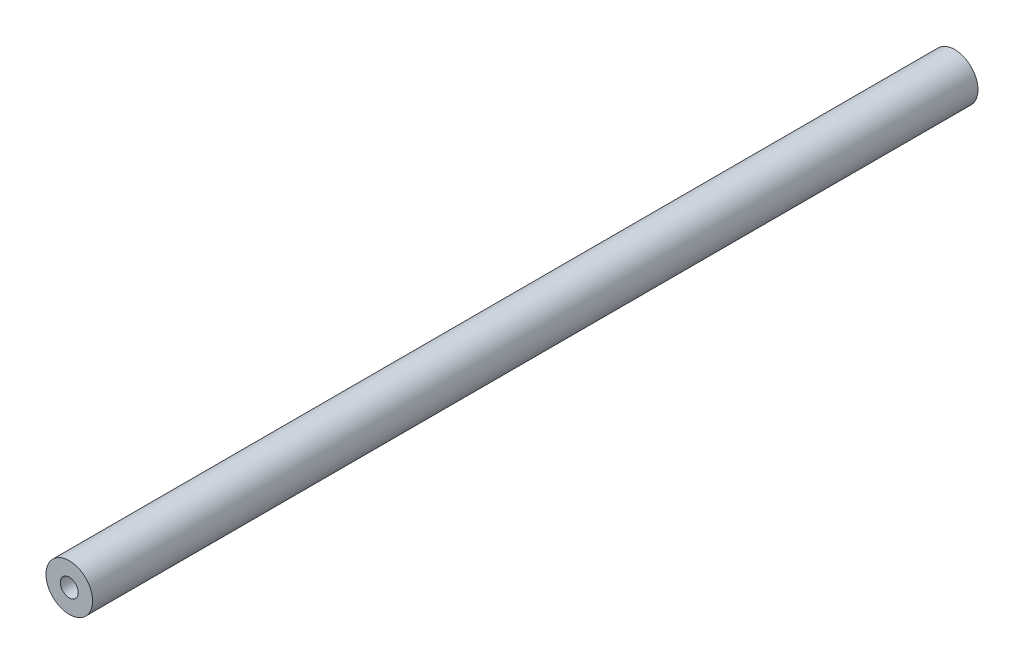
ISO-10303-21;
HEADER;
FILE_DESCRIPTION(('STEP AP214'),'2;1');
FILE_NAME('part.step','',(''),(''),'','','');
FILE_SCHEMA(('AUTOMOTIVE_DESIGN { 1 0 10303 214 1 1 1 1 }'));
ENDSEC;
DATA;
#1=APPLICATION_CONTEXT('core data for automotive mechanical design processes');
#2=APPLICATION_PROTOCOL_DEFINITION('international standard','automotive_design',2000,#1);
#3=PRODUCT_CONTEXT('',#1,'mechanical');
#4=PRODUCT('Part','Part','',(#3));
#5=PRODUCT_RELATED_PRODUCT_CATEGORY('part','',(#4));
#6=PRODUCT_DEFINITION_FORMATION('','',#4);
#7=PRODUCT_DEFINITION_CONTEXT('part definition',#1,'design');
#8=PRODUCT_DEFINITION('design','',#6,#7);
#9=PRODUCT_DEFINITION_SHAPE('','',#8);
#10=(LENGTH_UNIT() NAMED_UNIT(*) SI_UNIT(.MILLI.,.METRE.));
#11=(NAMED_UNIT(*) PLANE_ANGLE_UNIT() SI_UNIT($,.RADIAN.));
#12=(NAMED_UNIT(*) SI_UNIT($,.STERADIAN.) SOLID_ANGLE_UNIT());
#13=UNCERTAINTY_MEASURE_WITH_UNIT(LENGTH_MEASURE(1.E-05),#10,'distance_accuracy_value','');
#14=(GEOMETRIC_REPRESENTATION_CONTEXT(3) GLOBAL_UNCERTAINTY_ASSIGNED_CONTEXT((#13)) GLOBAL_UNIT_ASSIGNED_CONTEXT((#10,
#11,#12)) REPRESENTATION_CONTEXT('',''));
#15=CARTESIAN_POINT('',(0.,0.,0.));
#16=DIRECTION('',(0.,0.,1.));
#17=DIRECTION('',(1.,0.,0.));
#18=AXIS2_PLACEMENT_3D('',#15,#16,#17);
#19=CARTESIAN_POINT('',(0.,0.,123.5));
#20=DIRECTION('',(0.,0.,-1.));
#21=DIRECTION('',(-1.,0.,0.));
#22=AXIS2_PLACEMENT_3D('',#19,#20,#21);
#23=CYLINDRICAL_SURFACE('',#22,3.25);
#24=CARTESIAN_POINT('',(0.,0.,123.5));
#25=DIRECTION('',(0.,0.,1.));
#26=DIRECTION('',(1.,0.,0.));
#27=AXIS2_PLACEMENT_3D('',#24,#25,#26);
#28=CIRCLE('',#27,3.25);
#29=CARTESIAN_POINT('',(3.25,0.,123.5));
#30=VERTEX_POINT('',#29);
#31=EDGE_CURVE('E10',#30,#30,#28,.T.);
#32=ORIENTED_EDGE('',*,*,#31,.F.);
#33=EDGE_LOOP('',(#32));
#34=FACE_BOUND('',#33,.T.);
#35=CARTESIAN_POINT('',(0.,0.,0.));
#36=DIRECTION('',(0.,0.,1.));
#37=DIRECTION('',(1.,0.,0.));
#38=AXIS2_PLACEMENT_3D('',#35,#36,#37);
#39=CIRCLE('',#38,3.25);
#40=CARTESIAN_POINT('',(3.25,0.,0.));
#41=VERTEX_POINT('',#40);
#42=EDGE_CURVE('E38',#41,#41,#39,.T.);
#43=ORIENTED_EDGE('',*,*,#42,.T.);
#44=EDGE_LOOP('',(#43));
#45=FACE_BOUND('',#44,.T.);
#46=ADVANCED_FACE('F35',(#34,#45),#23,.T.);
#47=CARTESIAN_POINT('',(0.,0.,123.5));
#48=DIRECTION('',(0.,0.,1.));
#49=DIRECTION('',(1.,0.,0.));
#50=AXIS2_PLACEMENT_3D('',#47,#48,#49);
#51=PLANE('',#50);
#52=CARTESIAN_POINT('',(0.,0.,123.5));
#53=DIRECTION('',(0.,0.,1.));
#54=DIRECTION('',(1.,0.,0.));
#55=AXIS2_PLACEMENT_3D('',#52,#53,#54);
#56=CIRCLE('',#55,1.25);
#57=CARTESIAN_POINT('',(1.25,0.,123.5));
#58=VERTEX_POINT('',#57);
#59=EDGE_CURVE('E47',#58,#58,#56,.T.);
#60=ORIENTED_EDGE('',*,*,#59,.F.);
#61=EDGE_LOOP('',(#60));
#62=FACE_BOUND('',#61,.T.);
#63=ORIENTED_EDGE('',*,*,#31,.T.);
#64=EDGE_LOOP('',(#63));
#65=FACE_BOUND('',#64,.T.);
#66=ADVANCED_FACE('F72',(#62,#65),#51,.T.);
#67=CARTESIAN_POINT('',(0.,0.,0.));
#68=DIRECTION('',(0.,0.,1.));
#69=DIRECTION('',(1.,0.,0.));
#70=AXIS2_PLACEMENT_3D('',#67,#68,#69);
#71=PLANE('',#70);
#72=CARTESIAN_POINT('',(0.,0.,0.));
#73=DIRECTION('',(0.,0.,-1.));
#74=DIRECTION('',(-1.,0.,0.));
#75=AXIS2_PLACEMENT_3D('',#72,#73,#74);
#76=CIRCLE('',#75,1.25);
#77=CARTESIAN_POINT('',(-1.25,0.,0.));
#78=VERTEX_POINT('',#77);
#79=EDGE_CURVE('E53',#78,#78,#76,.T.);
#80=ORIENTED_EDGE('',*,*,#79,.F.);
#81=EDGE_LOOP('',(#80));
#82=FACE_BOUND('',#81,.T.);
#83=ORIENTED_EDGE('',*,*,#42,.F.);
#84=EDGE_LOOP('',(#83));
#85=FACE_BOUND('',#84,.T.);
#86=ADVANCED_FACE('F68',(#82,#85),#71,.F.);
#87=CARTESIAN_POINT('',(0.,0.,113.5));
#88=DIRECTION('',(0.,0.,1.));
#89=DIRECTION('',(1.,0.,0.));
#90=AXIS2_PLACEMENT_3D('',#87,#88,#89);
#91=CYLINDRICAL_SURFACE('',#90,1.25);
#92=CARTESIAN_POINT('',(0.,0.,113.5));
#93=DIRECTION('',(0.,0.,1.));
#94=DIRECTION('',(1.,0.,0.));
#95=AXIS2_PLACEMENT_3D('',#92,#93,#94);
#96=CIRCLE('',#95,1.25);
#97=CARTESIAN_POINT('',(1.25,0.,113.5));
#98=VERTEX_POINT('',#97);
#99=EDGE_CURVE('E45',#98,#98,#96,.T.);
#100=ORIENTED_EDGE('',*,*,#99,.F.);
#101=EDGE_LOOP('',(#100));
#102=FACE_BOUND('',#101,.T.);
#103=ORIENTED_EDGE('',*,*,#59,.T.);
#104=EDGE_LOOP('',(#103));
#105=FACE_BOUND('',#104,.T.);
#106=ADVANCED_FACE('F71',(#102,#105),#91,.F.);
#107=CARTESIAN_POINT('',(0.,0.,113.5));
#108=DIRECTION('',(0.,0.,1.));
#109=DIRECTION('',(1.,0.,0.));
#110=AXIS2_PLACEMENT_3D('',#107,#108,#109);
#111=PLANE('',#110);
#112=ORIENTED_EDGE('',*,*,#99,.T.);
#113=EDGE_LOOP('',(#112));
#114=FACE_BOUND('',#113,.T.);
#115=ADVANCED_FACE('F64',(#114),#111,.T.);
#116=CARTESIAN_POINT('',(0.,0.,10.));
#117=DIRECTION('',(0.,0.,-1.));
#118=DIRECTION('',(-1.,0.,0.));
#119=AXIS2_PLACEMENT_3D('',#116,#117,#118);
#120=CYLINDRICAL_SURFACE('',#119,1.25);
#121=CARTESIAN_POINT('',(0.,0.,10.));
#122=DIRECTION('',(0.,0.,-1.));
#123=DIRECTION('',(-1.,0.,0.));
#124=AXIS2_PLACEMENT_3D('',#121,#122,#123);
#125=CIRCLE('',#124,1.25);
#126=CARTESIAN_POINT('',(-1.25,0.,10.));
#127=VERTEX_POINT('',#126);
#128=EDGE_CURVE('E50',#127,#127,#125,.T.);
#129=ORIENTED_EDGE('',*,*,#128,.F.);
#130=EDGE_LOOP('',(#129));
#131=FACE_BOUND('',#130,.T.);
#132=ORIENTED_EDGE('',*,*,#79,.T.);
#133=EDGE_LOOP('',(#132));
#134=FACE_BOUND('',#133,.T.);
#135=ADVANCED_FACE('F61',(#131,#134),#120,.F.);
#136=CARTESIAN_POINT('',(0.,0.,10.));
#137=DIRECTION('',(0.,0.,-1.));
#138=DIRECTION('',(-1.,0.,0.));
#139=AXIS2_PLACEMENT_3D('',#136,#137,#138);
#140=PLANE('',#139);
#141=ORIENTED_EDGE('',*,*,#128,.T.);
#142=EDGE_LOOP('',(#141));
#143=FACE_BOUND('',#142,.T.);
#144=ADVANCED_FACE('F59',(#143),#140,.T.);
#145=CLOSED_SHELL('',(#46,#66,#86,#106,#115,#135,#144));
#146=MANIFOLD_SOLID_BREP('B2',#145);
#147=ADVANCED_BREP_SHAPE_REPRESENTATION('',(#18,#146),#14);
#148=SHAPE_DEFINITION_REPRESENTATION(#9,#147);
ENDSEC;
END-ISO-10303-21;
